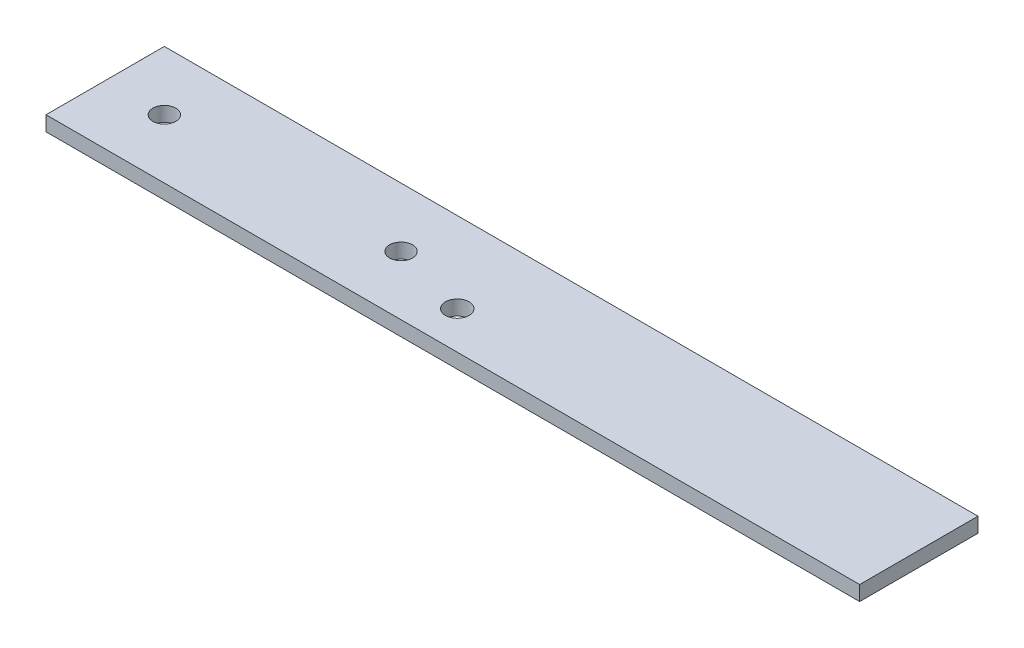
ISO-10303-21;
HEADER;
FILE_DESCRIPTION(('STEP AP214'),'2;1');
FILE_NAME('part.step','',(''),(''),'','','');
FILE_SCHEMA(('AUTOMOTIVE_DESIGN { 1 0 10303 214 1 1 1 1 }'));
ENDSEC;
DATA;
#1=APPLICATION_CONTEXT('core data for automotive mechanical design processes');
#2=APPLICATION_PROTOCOL_DEFINITION('international standard','automotive_design',2000,#1);
#3=PRODUCT_CONTEXT('',#1,'mechanical');
#4=PRODUCT('Part','Part','',(#3));
#5=PRODUCT_RELATED_PRODUCT_CATEGORY('part','',(#4));
#6=PRODUCT_DEFINITION_FORMATION('','',#4);
#7=PRODUCT_DEFINITION_CONTEXT('part definition',#1,'design');
#8=PRODUCT_DEFINITION('design','',#6,#7);
#9=PRODUCT_DEFINITION_SHAPE('','',#8);
#10=(LENGTH_UNIT() NAMED_UNIT(*) SI_UNIT(.MILLI.,.METRE.));
#11=(NAMED_UNIT(*) PLANE_ANGLE_UNIT() SI_UNIT($,.RADIAN.));
#12=(NAMED_UNIT(*) SI_UNIT($,.STERADIAN.) SOLID_ANGLE_UNIT());
#13=UNCERTAINTY_MEASURE_WITH_UNIT(LENGTH_MEASURE(1.E-05),#10,'distance_accuracy_value','');
#14=(GEOMETRIC_REPRESENTATION_CONTEXT(3) GLOBAL_UNCERTAINTY_ASSIGNED_CONTEXT((#13)) GLOBAL_UNIT_ASSIGNED_CONTEXT((#10,
#11,#12)) REPRESENTATION_CONTEXT('',''));
#15=CARTESIAN_POINT('',(0.,0.,0.));
#16=DIRECTION('',(0.,0.,1.));
#17=DIRECTION('',(1.,0.,0.));
#18=AXIS2_PLACEMENT_3D('',#15,#16,#17);
#19=CARTESIAN_POINT('',(0.,2.,0.));
#20=DIRECTION('',(0.,-1.,0.));
#21=DIRECTION('',(0.,0.,-1.));
#22=AXIS2_PLACEMENT_3D('',#19,#20,#21);
#23=PLANE('',#22);
#24=CARTESIAN_POINT('',(40.,2.,-8.));
#25=DIRECTION('',(0.,1.,0.));
#26=DIRECTION('',(0.,0.,1.));
#27=AXIS2_PLACEMENT_3D('',#24,#25,#26);
#28=CIRCLE('',#27,1.55);
#29=CARTESIAN_POINT('',(40.,2.,-6.45));
#30=VERTEX_POINT('',#29);
#31=EDGE_CURVE('E117',#30,#30,#28,.T.);
#32=ORIENTED_EDGE('',*,*,#31,.F.);
#33=EDGE_LOOP('',(#32));
#34=FACE_BOUND('',#33,.T.);
#35=DIRECTION('',(1.,0.,0.));
#36=VECTOR('',#35,1.);
#37=CARTESIAN_POINT('',(110.,2.,0.));
#38=LINE('',#37,#36);
#39=CARTESIAN_POINT('',(0.,2.,0.));
#40=VERTEX_POINT('',#39);
#41=CARTESIAN_POINT('',(110.,2.,0.));
#42=VERTEX_POINT('',#41);
#43=EDGE_CURVE('E87',#40,#42,#38,.T.);
#44=ORIENTED_EDGE('',*,*,#43,.T.);
#45=DIRECTION('',(0.,0.,-1.));
#46=VECTOR('',#45,1.);
#47=CARTESIAN_POINT('',(110.,2.,-16.));
#48=LINE('',#47,#46);
#49=CARTESIAN_POINT('',(110.,2.,-16.));
#50=VERTEX_POINT('',#49);
#51=EDGE_CURVE('E82',#42,#50,#48,.T.);
#52=ORIENTED_EDGE('',*,*,#51,.T.);
#53=DIRECTION('',(-1.,0.,0.));
#54=VECTOR('',#53,1.);
#55=CARTESIAN_POINT('',(0.,2.,-16.));
#56=LINE('',#55,#54);
#57=CARTESIAN_POINT('',(0.,2.,-16.));
#58=VERTEX_POINT('',#57);
#59=EDGE_CURVE('E85',#50,#58,#56,.T.);
#60=ORIENTED_EDGE('',*,*,#59,.T.);
#61=DIRECTION('',(0.,0.,1.));
#62=VECTOR('',#61,1.);
#63=CARTESIAN_POINT('',(0.,2.,0.));
#64=LINE('',#63,#62);
#65=EDGE_CURVE('E52',#58,#40,#64,.T.);
#66=ORIENTED_EDGE('',*,*,#65,.T.);
#67=EDGE_LOOP('',(#44,#52,#60,#66));
#68=FACE_BOUND('',#67,.T.);
#69=CARTESIAN_POINT('',(8.,2.,-8.));
#70=DIRECTION('',(0.,1.,0.));
#71=DIRECTION('',(0.,0.,1.));
#72=AXIS2_PLACEMENT_3D('',#69,#70,#71);
#73=CIRCLE('',#72,1.55);
#74=CARTESIAN_POINT('',(8.,2.,-6.45));
#75=VERTEX_POINT('',#74);
#76=EDGE_CURVE('E102',#75,#75,#73,.T.);
#77=ORIENTED_EDGE('',*,*,#76,.F.);
#78=EDGE_LOOP('',(#77));
#79=FACE_BOUND('',#78,.T.);
#80=CARTESIAN_POINT('',(50.5,2.,-5.1));
#81=DIRECTION('',(0.,1.,0.));
#82=DIRECTION('',(0.,0.,1.));
#83=AXIS2_PLACEMENT_3D('',#80,#81,#82);
#84=CIRCLE('',#83,1.60000000000001);
#85=CARTESIAN_POINT('',(50.5,2.,-3.49999999999999));
#86=VERTEX_POINT('',#85);
#87=EDGE_CURVE('E123',#86,#86,#84,.T.);
#88=ORIENTED_EDGE('',*,*,#87,.F.);
#89=EDGE_LOOP('',(#88));
#90=FACE_BOUND('',#89,.T.);
#91=ADVANCED_FACE('F35',(#34,#68,#79,#90),#23,.F.);
#92=CARTESIAN_POINT('',(0.,0.,0.));
#93=DIRECTION('',(0.,-1.,0.));
#94=DIRECTION('',(0.,0.,-1.));
#95=AXIS2_PLACEMENT_3D('',#92,#93,#94);
#96=PLANE('',#95);
#97=CARTESIAN_POINT('',(40.,0.,-8.));
#98=DIRECTION('',(0.,1.,0.));
#99=DIRECTION('',(0.,0.,1.));
#100=AXIS2_PLACEMENT_3D('',#97,#98,#99);
#101=CIRCLE('',#100,1.55);
#102=CARTESIAN_POINT('',(40.,0.,-6.45));
#103=VERTEX_POINT('',#102);
#104=EDGE_CURVE('E120',#103,#103,#101,.T.);
#105=ORIENTED_EDGE('',*,*,#104,.T.);
#106=EDGE_LOOP('',(#105));
#107=FACE_BOUND('',#106,.T.);
#108=DIRECTION('',(1.,0.,0.));
#109=VECTOR('',#108,1.);
#110=CARTESIAN_POINT('',(110.,0.,0.));
#111=LINE('',#110,#109);
#112=CARTESIAN_POINT('',(0.,0.,0.));
#113=VERTEX_POINT('',#112);
#114=CARTESIAN_POINT('',(110.,0.,0.));
#115=VERTEX_POINT('',#114);
#116=EDGE_CURVE('E99',#113,#115,#111,.T.);
#117=ORIENTED_EDGE('',*,*,#116,.F.);
#118=DIRECTION('',(0.,0.,1.));
#119=VECTOR('',#118,1.);
#120=CARTESIAN_POINT('',(0.,0.,0.));
#121=LINE('',#120,#119);
#122=CARTESIAN_POINT('',(0.,0.,-16.));
#123=VERTEX_POINT('',#122);
#124=EDGE_CURVE('E75',#123,#113,#121,.T.);
#125=ORIENTED_EDGE('',*,*,#124,.F.);
#126=DIRECTION('',(-1.,0.,0.));
#127=VECTOR('',#126,1.);
#128=CARTESIAN_POINT('',(0.,0.,-16.));
#129=LINE('',#128,#127);
#130=CARTESIAN_POINT('',(110.,0.,-16.));
#131=VERTEX_POINT('',#130);
#132=EDGE_CURVE('E69',#131,#123,#129,.T.);
#133=ORIENTED_EDGE('',*,*,#132,.F.);
#134=DIRECTION('',(0.,0.,-1.));
#135=VECTOR('',#134,1.);
#136=CARTESIAN_POINT('',(110.,0.,-16.));
#137=LINE('',#136,#135);
#138=EDGE_CURVE('E91',#115,#131,#137,.T.);
#139=ORIENTED_EDGE('',*,*,#138,.F.);
#140=EDGE_LOOP('',(#117,#125,#133,#139));
#141=FACE_BOUND('',#140,.T.);
#142=CARTESIAN_POINT('',(8.,0.,-8.));
#143=DIRECTION('',(0.,1.,0.));
#144=DIRECTION('',(0.,0.,1.));
#145=AXIS2_PLACEMENT_3D('',#142,#143,#144);
#146=CIRCLE('',#145,1.55);
#147=CARTESIAN_POINT('',(8.,0.,-6.45));
#148=VERTEX_POINT('',#147);
#149=EDGE_CURVE('E114',#148,#148,#146,.T.);
#150=ORIENTED_EDGE('',*,*,#149,.T.);
#151=EDGE_LOOP('',(#150));
#152=FACE_BOUND('',#151,.T.);
#153=CARTESIAN_POINT('',(50.5,0.,-5.1));
#154=DIRECTION('',(0.,1.,0.));
#155=DIRECTION('',(0.,0.,1.));
#156=AXIS2_PLACEMENT_3D('',#153,#154,#155);
#157=CIRCLE('',#156,1.60000000000001);
#158=CARTESIAN_POINT('',(50.5,0.,-3.49999999999999));
#159=VERTEX_POINT('',#158);
#160=EDGE_CURVE('E126',#159,#159,#157,.T.);
#161=ORIENTED_EDGE('',*,*,#160,.T.);
#162=EDGE_LOOP('',(#161));
#163=FACE_BOUND('',#162,.T.);
#164=ADVANCED_FACE('F110',(#107,#141,#152,#163),#96,.T.);
#165=CARTESIAN_POINT('',(110.,2.,0.));
#166=DIRECTION('',(0.,0.,-1.));
#167=DIRECTION('',(-1.,0.,0.));
#168=AXIS2_PLACEMENT_3D('',#165,#166,#167);
#169=PLANE('',#168);
#170=ORIENTED_EDGE('',*,*,#116,.T.);
#171=DIRECTION('',(0.,-1.,0.));
#172=VECTOR('',#171,1.);
#173=CARTESIAN_POINT('',(110.,2.,0.));
#174=LINE('',#173,#172);
#175=EDGE_CURVE('E11',#42,#115,#174,.T.);
#176=ORIENTED_EDGE('',*,*,#175,.F.);
#177=ORIENTED_EDGE('',*,*,#43,.F.);
#178=DIRECTION('',(0.,-1.,0.));
#179=VECTOR('',#178,1.);
#180=CARTESIAN_POINT('',(0.,2.,0.));
#181=LINE('',#180,#179);
#182=EDGE_CURVE('E95',#40,#113,#181,.T.);
#183=ORIENTED_EDGE('',*,*,#182,.T.);
#184=EDGE_LOOP('',(#170,#176,#177,#183));
#185=FACE_BOUND('',#184,.T.);
#186=ADVANCED_FACE('F37',(#185),#169,.F.);
#187=CARTESIAN_POINT('',(110.,2.,-16.));
#188=DIRECTION('',(-1.,0.,0.));
#189=DIRECTION('',(0.,0.,1.));
#190=AXIS2_PLACEMENT_3D('',#187,#188,#189);
#191=PLANE('',#190);
#192=ORIENTED_EDGE('',*,*,#138,.T.);
#193=DIRECTION('',(0.,-1.,0.));
#194=VECTOR('',#193,1.);
#195=CARTESIAN_POINT('',(110.,2.,-16.));
#196=LINE('',#195,#194);
#197=EDGE_CURVE('E44',#50,#131,#196,.T.);
#198=ORIENTED_EDGE('',*,*,#197,.F.);
#199=ORIENTED_EDGE('',*,*,#51,.F.);
#200=ORIENTED_EDGE('',*,*,#175,.T.);
#201=EDGE_LOOP('',(#192,#198,#199,#200));
#202=FACE_BOUND('',#201,.T.);
#203=ADVANCED_FACE('F90',(#202),#191,.F.);
#204=CARTESIAN_POINT('',(0.,2.,-16.));
#205=DIRECTION('',(0.,0.,1.));
#206=DIRECTION('',(1.,0.,0.));
#207=AXIS2_PLACEMENT_3D('',#204,#205,#206);
#208=PLANE('',#207);
#209=ORIENTED_EDGE('',*,*,#132,.T.);
#210=DIRECTION('',(0.,-1.,0.));
#211=VECTOR('',#210,1.);
#212=CARTESIAN_POINT('',(0.,2.,-16.));
#213=LINE('',#212,#211);
#214=EDGE_CURVE('E92',#58,#123,#213,.T.);
#215=ORIENTED_EDGE('',*,*,#214,.F.);
#216=ORIENTED_EDGE('',*,*,#59,.F.);
#217=ORIENTED_EDGE('',*,*,#197,.T.);
#218=EDGE_LOOP('',(#209,#215,#216,#217));
#219=FACE_BOUND('',#218,.T.);
#220=ADVANCED_FACE('F93',(#219),#208,.F.);
#221=CARTESIAN_POINT('',(0.,2.,0.));
#222=DIRECTION('',(1.,0.,0.));
#223=DIRECTION('',(0.,0.,-1.));
#224=AXIS2_PLACEMENT_3D('',#221,#222,#223);
#225=PLANE('',#224);
#226=ORIENTED_EDGE('',*,*,#124,.T.);
#227=ORIENTED_EDGE('',*,*,#182,.F.);
#228=ORIENTED_EDGE('',*,*,#65,.F.);
#229=ORIENTED_EDGE('',*,*,#214,.T.);
#230=EDGE_LOOP('',(#226,#227,#228,#229));
#231=FACE_BOUND('',#230,.T.);
#232=ADVANCED_FACE('F107',(#231),#225,.F.);
#233=CARTESIAN_POINT('',(8.,2.,-8.));
#234=DIRECTION('',(0.,-1.,0.));
#235=DIRECTION('',(0.,0.,-1.));
#236=AXIS2_PLACEMENT_3D('',#233,#234,#235);
#237=CYLINDRICAL_SURFACE('',#236,1.55);
#238=ORIENTED_EDGE('',*,*,#76,.T.);
#239=EDGE_LOOP('',(#238));
#240=FACE_BOUND('',#239,.T.);
#241=ORIENTED_EDGE('',*,*,#149,.F.);
#242=EDGE_LOOP('',(#241));
#243=FACE_BOUND('',#242,.T.);
#244=ADVANCED_FACE('F145',(#240,#243),#237,.F.);
#245=CARTESIAN_POINT('',(40.,2.,-8.));
#246=DIRECTION('',(0.,-1.,0.));
#247=DIRECTION('',(0.,0.,-1.));
#248=AXIS2_PLACEMENT_3D('',#245,#246,#247);
#249=CYLINDRICAL_SURFACE('',#248,1.55);
#250=ORIENTED_EDGE('',*,*,#31,.T.);
#251=EDGE_LOOP('',(#250));
#252=FACE_BOUND('',#251,.T.);
#253=ORIENTED_EDGE('',*,*,#104,.F.);
#254=EDGE_LOOP('',(#253));
#255=FACE_BOUND('',#254,.T.);
#256=ADVANCED_FACE('F191',(#252,#255),#249,.F.);
#257=CARTESIAN_POINT('',(50.5,2.,-5.1));
#258=DIRECTION('',(0.,-1.,0.));
#259=DIRECTION('',(0.,0.,-1.));
#260=AXIS2_PLACEMENT_3D('',#257,#258,#259);
#261=CYLINDRICAL_SURFACE('',#260,1.60000000000001);
#262=ORIENTED_EDGE('',*,*,#87,.T.);
#263=EDGE_LOOP('',(#262));
#264=FACE_BOUND('',#263,.T.);
#265=ORIENTED_EDGE('',*,*,#160,.F.);
#266=EDGE_LOOP('',(#265));
#267=FACE_BOUND('',#266,.T.);
#268=ADVANCED_FACE('F132',(#264,#267),#261,.F.);
#269=CLOSED_SHELL('',(#91,#164,#186,#203,#220,#232,#244,#256,#268));
#270=MANIFOLD_SOLID_BREP('B2',#269);
#271=ADVANCED_BREP_SHAPE_REPRESENTATION('',(#18,#270),#14);
#272=SHAPE_DEFINITION_REPRESENTATION(#9,#271);
ENDSEC;
END-ISO-10303-21;
